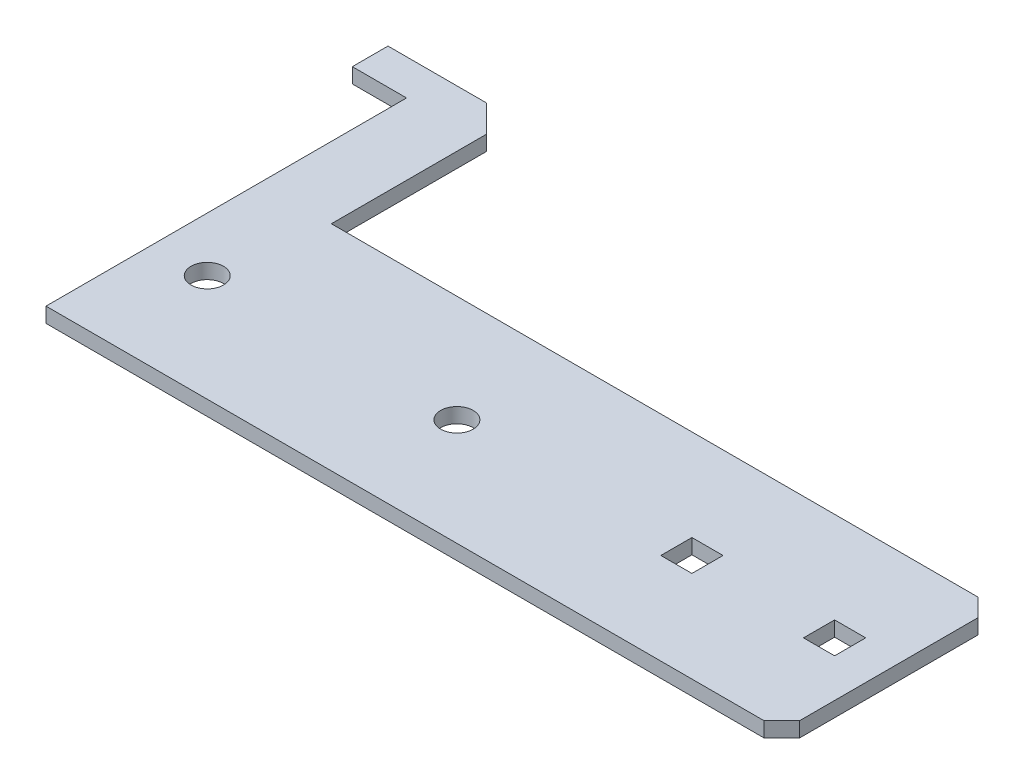
ISO-10303-21;
HEADER;
FILE_DESCRIPTION(('STEP AP214'),'2;1');
FILE_NAME('part.step','',(''),(''),'','','');
FILE_SCHEMA(('AUTOMOTIVE_DESIGN { 1 0 10303 214 1 1 1 1 }'));
ENDSEC;
DATA;
#1=APPLICATION_CONTEXT('core data for automotive mechanical design processes');
#2=APPLICATION_PROTOCOL_DEFINITION('international standard','automotive_design',2000,#1);
#3=PRODUCT_CONTEXT('',#1,'mechanical');
#4=PRODUCT('Part','Part','',(#3));
#5=PRODUCT_RELATED_PRODUCT_CATEGORY('part','',(#4));
#6=PRODUCT_DEFINITION_FORMATION('','',#4);
#7=PRODUCT_DEFINITION_CONTEXT('part definition',#1,'design');
#8=PRODUCT_DEFINITION('design','',#6,#7);
#9=PRODUCT_DEFINITION_SHAPE('','',#8);
#10=(LENGTH_UNIT() NAMED_UNIT(*) SI_UNIT(.MILLI.,.METRE.));
#11=(NAMED_UNIT(*) PLANE_ANGLE_UNIT() SI_UNIT($,.RADIAN.));
#12=(NAMED_UNIT(*) SI_UNIT($,.STERADIAN.) SOLID_ANGLE_UNIT());
#13=UNCERTAINTY_MEASURE_WITH_UNIT(LENGTH_MEASURE(1.E-05),#10,'distance_accuracy_value','');
#14=(GEOMETRIC_REPRESENTATION_CONTEXT(3) GLOBAL_UNCERTAINTY_ASSIGNED_CONTEXT((#13)) GLOBAL_UNIT_ASSIGNED_CONTEXT((#10,
#11,#12)) REPRESENTATION_CONTEXT('',''));
#15=CARTESIAN_POINT('',(0.,0.,0.));
#16=DIRECTION('',(0.,0.,1.));
#17=DIRECTION('',(1.,0.,0.));
#18=AXIS2_PLACEMENT_3D('',#15,#16,#17);
#19=CARTESIAN_POINT('',(66.6427164995796,0.,19.05));
#20=DIRECTION('',(0.,0.,1.));
#21=DIRECTION('',(-1.,0.,0.));
#22=AXIS2_PLACEMENT_3D('',#19,#20,#21);
#23=PLANE('',#22);
#24=DIRECTION('',(-1.,0.,0.));
#25=VECTOR('',#24,1.);
#26=CARTESIAN_POINT('',(66.6427164995796,0.,19.05));
#27=LINE('',#26,#25);
#28=CARTESIAN_POINT('',(127.815201616605,0.,19.05));
#29=VERTEX_POINT('',#28);
#30=CARTESIAN_POINT('',(0.,0.,19.05));
#31=VERTEX_POINT('',#30);
#32=EDGE_CURVE('E13',#29,#31,#27,.T.);
#33=ORIENTED_EDGE('',*,*,#32,.T.);
#34=DIRECTION('',(0.,1.,0.));
#35=VECTOR('',#34,1.);
#36=CARTESIAN_POINT('',(0.,0.,19.05));
#37=LINE('',#36,#35);
#38=CARTESIAN_POINT('',(0.,-2.667,19.05));
#39=VERTEX_POINT('',#38);
#40=EDGE_CURVE('E445',#39,#31,#37,.T.);
#41=ORIENTED_EDGE('',*,*,#40,.F.);
#42=DIRECTION('',(1.,0.,0.));
#43=VECTOR('',#42,1.);
#44=CARTESIAN_POINT('',(66.6427164995796,-2.667,19.05));
#45=LINE('',#44,#43);
#46=CARTESIAN_POINT('',(127.815201616605,-2.667,19.05));
#47=VERTEX_POINT('',#46);
#48=EDGE_CURVE('E183',#47,#39,#45,.F.);
#49=ORIENTED_EDGE('',*,*,#48,.F.);
#50=DIRECTION('',(0.,1.,0.));
#51=VECTOR('',#50,1.);
#52=CARTESIAN_POINT('',(127.815201616605,0.,19.05));
#53=LINE('',#52,#51);
#54=EDGE_CURVE('E301',#47,#29,#53,.T.);
#55=ORIENTED_EDGE('',*,*,#54,.T.);
#56=EDGE_LOOP('',(#33,#41,#49,#55));
#57=FACE_BOUND('',#56,.T.);
#58=ADVANCED_FACE('F77',(#57),#23,.T.);
#59=CARTESIAN_POINT('',(66.6427164995796,0.,-19.05));
#60=DIRECTION('',(0.,0.,1.));
#61=DIRECTION('',(-1.,0.,0.));
#62=AXIS2_PLACEMENT_3D('',#59,#60,#61);
#63=PLANE('',#62);
#64=DIRECTION('',(1.,0.,0.));
#65=VECTOR('',#64,1.);
#66=CARTESIAN_POINT('',(66.6427164995796,-2.667,-19.05));
#67=LINE('',#66,#65);
#68=CARTESIAN_POINT('',(127.815201616605,-2.667,-19.05));
#69=VERTEX_POINT('',#68);
#70=CARTESIAN_POINT('',(12.7,-2.66699999999987,-19.05));
#71=VERTEX_POINT('',#70);
#72=EDGE_CURVE('E81',#69,#71,#67,.F.);
#73=ORIENTED_EDGE('',*,*,#72,.T.);
#74=DIRECTION('',(0.,1.,0.));
#75=VECTOR('',#74,1.);
#76=CARTESIAN_POINT('',(12.7,-2.66699999999987,-19.05));
#77=LINE('',#76,#75);
#78=CARTESIAN_POINT('',(12.7,0.,-19.05));
#79=VERTEX_POINT('',#78);
#80=EDGE_CURVE('E421',#71,#79,#77,.T.);
#81=ORIENTED_EDGE('',*,*,#80,.T.);
#82=DIRECTION('',(-1.,0.,0.));
#83=VECTOR('',#82,1.);
#84=CARTESIAN_POINT('',(66.6427164995796,0.,-19.05));
#85=LINE('',#84,#83);
#86=CARTESIAN_POINT('',(127.815201616605,0.,-19.05));
#87=VERTEX_POINT('',#86);
#88=EDGE_CURVE('E88',#87,#79,#85,.T.);
#89=ORIENTED_EDGE('',*,*,#88,.F.);
#90=DIRECTION('',(0.,1.,0.));
#91=VECTOR('',#90,1.);
#92=CARTESIAN_POINT('',(127.815201616605,0.,-19.05));
#93=LINE('',#92,#91);
#94=EDGE_CURVE('E292',#87,#69,#93,.F.);
#95=ORIENTED_EDGE('',*,*,#94,.T.);
#96=EDGE_LOOP('',(#73,#81,#89,#95));
#97=FACE_BOUND('',#96,.T.);
#98=ADVANCED_FACE('F419',(#97),#63,.F.);
#99=CARTESIAN_POINT('',(0.,0.,19.05));
#100=DIRECTION('',(0.,-1.,0.));
#101=DIRECTION('',(1.,0.,0.));
#102=AXIS2_PLACEMENT_3D('',#99,#100,#101);
#103=PLANE('',#102);
#104=ORIENTED_EDGE('',*,*,#88,.T.);
#105=DIRECTION('',(0.,0.,1.));
#106=VECTOR('',#105,1.);
#107=CARTESIAN_POINT('',(12.7,1.17961196366423E-13,-31.9266755627747));
#108=LINE('',#107,#106);
#109=CARTESIAN_POINT('',(12.6999999999998,2.22044604925031E-13,-46.6586755627749));
#110=VERTEX_POINT('',#109);
#111=EDGE_CURVE('E263',#110,#79,#108,.T.);
#112=ORIENTED_EDGE('',*,*,#111,.F.);
#113=DIRECTION('',(0.707106781186553,0.,0.707106781186542));
#114=VECTOR('',#113,1.);
#115=CARTESIAN_POINT('',(15.0494999999999,2.28983498828939E-13,-44.3091755627748));
#116=LINE('',#115,#114);
#117=CARTESIAN_POINT('',(7.87399999999977,2.0122792321331E-13,-51.4846755627748));
#118=VERTEX_POINT('',#117);
#119=EDGE_CURVE('E250',#110,#118,#116,.F.);
#120=ORIENTED_EDGE('',*,*,#119,.T.);
#121=DIRECTION('',(1.,0.,0.));
#122=VECTOR('',#121,1.);
#123=CARTESIAN_POINT('',(12.6999999999997,2.4980018054066E-13,-51.4846755627749));
#124=LINE('',#123,#122);
#125=CARTESIAN_POINT('',(-9.65200000000025,0.,-51.4846755627746));
#126=VERTEX_POINT('',#125);
#127=EDGE_CURVE('E273',#126,#118,#124,.T.);
#128=ORIENTED_EDGE('',*,*,#127,.F.);
#129=DIRECTION('',(0.,0.,-1.));
#130=VECTOR('',#129,1.);
#131=CARTESIAN_POINT('',(-9.65200000000025,0.,-51.4846755627746));
#132=LINE('',#131,#130);
#133=CARTESIAN_POINT('',(-9.65200000000018,0.,-45.1346755627746));
#134=VERTEX_POINT('',#133);
#135=EDGE_CURVE('E281',#134,#126,#132,.T.);
#136=ORIENTED_EDGE('',*,*,#135,.F.);
#137=DIRECTION('',(-1.,0.,0.));
#138=VECTOR('',#137,1.);
#139=CARTESIAN_POINT('',(-1.84688911891214E-13,0.,-45.1346755627747));
#140=LINE('',#139,#138);
#141=CARTESIAN_POINT('',(-1.84074279221134E-13,0.,-45.1346755627747));
#142=VERTEX_POINT('',#141);
#143=EDGE_CURVE('E287',#142,#134,#140,.T.);
#144=ORIENTED_EDGE('',*,*,#143,.F.);
#145=DIRECTION('',(0.,0.,-1.));
#146=VECTOR('',#145,1.);
#147=CARTESIAN_POINT('',(-2.53759104787382E-13,1.11022302462516E-13,-51.4846755627747));
#148=LINE('',#147,#146);
#149=EDGE_CURVE('E221',#31,#142,#148,.T.);
#150=ORIENTED_EDGE('',*,*,#149,.F.);
#151=ORIENTED_EDGE('',*,*,#32,.F.);
#152=DIRECTION('',(0.707106781186549,0.,-0.707106781186546));
#153=VECTOR('',#152,1.);
#154=CARTESIAN_POINT('',(127.815201616605,0.,19.05));
#155=LINE('',#154,#153);
#156=CARTESIAN_POINT('',(130.990201616605,0.,15.875));
#157=VERTEX_POINT('',#156);
#158=EDGE_CURVE('E311',#29,#157,#155,.T.);
#159=ORIENTED_EDGE('',*,*,#158,.T.);
#160=DIRECTION('',(0.,0.,-1.));
#161=VECTOR('',#160,1.);
#162=CARTESIAN_POINT('',(130.990201616605,0.,19.05));
#163=LINE('',#162,#161);
#164=CARTESIAN_POINT('',(130.990201616605,0.,-15.875));
#165=VERTEX_POINT('',#164);
#166=EDGE_CURVE('E307',#157,#165,#163,.T.);
#167=ORIENTED_EDGE('',*,*,#166,.T.);
#168=DIRECTION('',(0.707106781186549,0.,0.707106781186546));
#169=VECTOR('',#168,1.);
#170=CARTESIAN_POINT('',(130.990201616605,0.,-15.875));
#171=LINE('',#170,#169);
#172=EDGE_CURVE('E176',#165,#87,#171,.F.);
#173=ORIENTED_EDGE('',*,*,#172,.T.);
#174=EDGE_LOOP('',(#104,#112,#120,#128,#136,#144,#150,#151,#159,#167,#173));
#175=FACE_BOUND('',#174,.T.);
#176=DIRECTION('',(1.,0.,0.));
#177=VECTOR('',#176,1.);
#178=CARTESIAN_POINT('',(82.374601616605,0.,-2.7686));
#179=LINE('',#178,#177);
#180=CARTESIAN_POINT('',(93.169601616605,0.,-2.7686));
#181=VERTEX_POINT('',#180);
#182=CARTESIAN_POINT('',(98.706801616605,0.,-2.7686));
#183=VERTEX_POINT('',#182);
#184=EDGE_CURVE('E342',#181,#183,#179,.T.);
#185=ORIENTED_EDGE('',*,*,#184,.T.);
#186=DIRECTION('',(0.,0.,1.));
#187=VECTOR('',#186,1.);
#188=CARTESIAN_POINT('',(98.706801616605,0.,19.05));
#189=LINE('',#188,#187);
#190=CARTESIAN_POINT('',(98.706801616605,0.,2.7686));
#191=VERTEX_POINT('',#190);
#192=EDGE_CURVE('E338',#183,#191,#189,.T.);
#193=ORIENTED_EDGE('',*,*,#192,.T.);
#194=DIRECTION('',(-1.,0.,0.));
#195=VECTOR('',#194,1.);
#196=CARTESIAN_POINT('',(82.374601616605,0.,2.7686));
#197=LINE('',#196,#195);
#198=CARTESIAN_POINT('',(93.169601616605,0.,2.7686));
#199=VERTEX_POINT('',#198);
#200=EDGE_CURVE('E334',#191,#199,#197,.T.);
#201=ORIENTED_EDGE('',*,*,#200,.T.);
#202=DIRECTION('',(0.,0.,-1.));
#203=VECTOR('',#202,1.);
#204=CARTESIAN_POINT('',(93.169601616605,0.,19.05));
#205=LINE('',#204,#203);
#206=EDGE_CURVE('E330',#199,#181,#205,.T.);
#207=ORIENTED_EDGE('',*,*,#206,.T.);
#208=EDGE_LOOP('',(#185,#193,#201,#207));
#209=FACE_BOUND('',#208,.T.);
#210=DIRECTION('',(1.,0.,0.));
#211=VECTOR('',#210,1.);
#212=CARTESIAN_POINT('',(82.374601616605,0.,-2.7686));
#213=LINE('',#212,#211);
#214=CARTESIAN_POINT('',(118.569601616605,0.,-2.7686));
#215=VERTEX_POINT('',#214);
#216=CARTESIAN_POINT('',(124.106801616605,0.,-2.7686));
#217=VERTEX_POINT('',#216);
#218=EDGE_CURVE('E326',#215,#217,#213,.T.);
#219=ORIENTED_EDGE('',*,*,#218,.T.);
#220=DIRECTION('',(0.,0.,1.));
#221=VECTOR('',#220,1.);
#222=CARTESIAN_POINT('',(124.106801616605,0.,19.05));
#223=LINE('',#222,#221);
#224=CARTESIAN_POINT('',(124.106801616605,0.,2.7686));
#225=VERTEX_POINT('',#224);
#226=EDGE_CURVE('E322',#217,#225,#223,.T.);
#227=ORIENTED_EDGE('',*,*,#226,.T.);
#228=DIRECTION('',(-1.,0.,0.));
#229=VECTOR('',#228,1.);
#230=CARTESIAN_POINT('',(82.374601616605,0.,2.7686));
#231=LINE('',#230,#229);
#232=CARTESIAN_POINT('',(118.569601616605,0.,2.7686));
#233=VERTEX_POINT('',#232);
#234=EDGE_CURVE('E318',#225,#233,#231,.T.);
#235=ORIENTED_EDGE('',*,*,#234,.T.);
#236=DIRECTION('',(0.,0.,-1.));
#237=VECTOR('',#236,1.);
#238=CARTESIAN_POINT('',(118.569601616605,0.,19.05));
#239=LINE('',#238,#237);
#240=EDGE_CURVE('E314',#233,#215,#239,.T.);
#241=ORIENTED_EDGE('',*,*,#240,.T.);
#242=EDGE_LOOP('',(#219,#227,#235,#241));
#243=FACE_BOUND('',#242,.T.);
#244=CARTESIAN_POINT('',(9.652,0.,0.));
#245=DIRECTION('',(0.,1.,0.));
#246=DIRECTION('',(-1.,0.,0.));
#247=AXIS2_PLACEMENT_3D('',#244,#245,#246);
#248=CIRCLE('',#247,2.8956);
#249=CARTESIAN_POINT('',(12.5476,0.,0.));
#250=VERTEX_POINT('',#249);
#251=EDGE_CURVE('E430',#250,#250,#248,.T.);
#252=ORIENTED_EDGE('',*,*,#251,.F.);
#253=EDGE_LOOP('',(#252));
#254=FACE_BOUND('',#253,.T.);
#255=CARTESIAN_POINT('',(54.102,0.,0.));
#256=DIRECTION('',(0.,1.,0.));
#257=DIRECTION('',(-1.,0.,0.));
#258=AXIS2_PLACEMENT_3D('',#255,#256,#257);
#259=CIRCLE('',#258,2.8956);
#260=CARTESIAN_POINT('',(56.9976,0.,0.));
#261=VERTEX_POINT('',#260);
#262=EDGE_CURVE('E438',#261,#261,#259,.T.);
#263=ORIENTED_EDGE('',*,*,#262,.F.);
#264=EDGE_LOOP('',(#263));
#265=FACE_BOUND('',#264,.T.);
#266=ADVANCED_FACE('F79',(#175,#209,#243,#254,#265),#103,.F.);
#267=CARTESIAN_POINT('',(66.6427164995796,-2.667,19.05));
#268=DIRECTION('',(0.,-1.,0.));
#269=DIRECTION('',(1.,0.,0.));
#270=AXIS2_PLACEMENT_3D('',#267,#268,#269);
#271=PLANE('',#270);
#272=ORIENTED_EDGE('',*,*,#72,.F.);
#273=DIRECTION('',(-0.707106781186549,0.,-0.707106781186546));
#274=VECTOR('',#273,1.);
#275=CARTESIAN_POINT('',(124.144901616605,-2.66700000000002,-22.7203000000001));
#276=LINE('',#275,#274);
#277=CARTESIAN_POINT('',(130.990201616605,-2.66700000000001,-15.875));
#278=VERTEX_POINT('',#277);
#279=EDGE_CURVE('E295',#69,#278,#276,.F.);
#280=ORIENTED_EDGE('',*,*,#279,.T.);
#281=DIRECTION('',(0.,0.,-1.));
#282=VECTOR('',#281,1.);
#283=CARTESIAN_POINT('',(130.990201616605,-2.66700000000001,19.05));
#284=LINE('',#283,#282);
#285=CARTESIAN_POINT('',(130.990201616605,-2.66700000000001,15.875));
#286=VERTEX_POINT('',#285);
#287=EDGE_CURVE('E405',#286,#278,#284,.T.);
#288=ORIENTED_EDGE('',*,*,#287,.F.);
#289=DIRECTION('',(-0.707106781186549,0.,0.707106781186546));
#290=VECTOR('',#289,1.);
#291=CARTESIAN_POINT('',(105.094901616605,-2.667,41.7703));
#292=LINE('',#291,#290);
#293=EDGE_CURVE('E298',#286,#47,#292,.T.);
#294=ORIENTED_EDGE('',*,*,#293,.T.);
#295=ORIENTED_EDGE('',*,*,#48,.T.);
#296=DIRECTION('',(0.,0.,1.));
#297=VECTOR('',#296,1.);
#298=CARTESIAN_POINT('',(0.,-2.66700000000004,-29.2596755627747));
#299=LINE('',#298,#297);
#300=CARTESIAN_POINT('',(-1.54682543963391E-13,-2.66699999999993,-45.1346755627747));
#301=VERTEX_POINT('',#300);
#302=EDGE_CURVE('E226',#39,#301,#299,.F.);
#303=ORIENTED_EDGE('',*,*,#302,.T.);
#304=DIRECTION('',(-1.,0.,0.));
#305=VECTOR('',#304,1.);
#306=CARTESIAN_POINT('',(-1.5529717663347E-13,-2.66699999999999,-45.1346755627747));
#307=LINE('',#306,#305);
#308=CARTESIAN_POINT('',(-9.65200000000016,-2.66700000000009,-45.1346755627746));
#309=VERTEX_POINT('',#308);
#310=EDGE_CURVE('E237',#301,#309,#307,.T.);
#311=ORIENTED_EDGE('',*,*,#310,.T.);
#312=DIRECTION('',(0.,0.,-1.));
#313=VECTOR('',#312,1.);
#314=CARTESIAN_POINT('',(-9.65200000000022,-2.66700000000007,-51.4846755627746));
#315=LINE('',#314,#313);
#316=CARTESIAN_POINT('',(-9.65200000000022,-2.66700000000007,-51.4846755627746));
#317=VERTEX_POINT('',#316);
#318=EDGE_CURVE('E246',#309,#317,#315,.T.);
#319=ORIENTED_EDGE('',*,*,#318,.T.);
#320=DIRECTION('',(-1.,0.,0.));
#321=VECTOR('',#320,1.);
#322=CARTESIAN_POINT('',(-2.25277498675718E-13,-2.66699999999988,-51.4846755627748));
#323=LINE('',#322,#321);
#324=CARTESIAN_POINT('',(7.87399999999981,-2.6669999999998,-51.4846755627748));
#325=VERTEX_POINT('',#324);
#326=EDGE_CURVE('E259',#317,#325,#323,.F.);
#327=ORIENTED_EDGE('',*,*,#326,.T.);
#328=DIRECTION('',(-0.707106781186553,0.,-0.707106781186542));
#329=VECTOR('',#328,1.);
#330=CARTESIAN_POINT('',(7.87399999999981,-2.6669999999998,-51.4846755627748));
#331=LINE('',#330,#329);
#332=CARTESIAN_POINT('',(12.6999999999998,-2.66699999999978,-46.6586755627749));
#333=VERTEX_POINT('',#332);
#334=EDGE_CURVE('E256',#325,#333,#331,.F.);
#335=ORIENTED_EDGE('',*,*,#334,.T.);
#336=DIRECTION('',(0.,0.,-1.));
#337=VECTOR('',#336,1.);
#338=CARTESIAN_POINT('',(12.7,-2.6669999999999,-29.2596755627748));
#339=LINE('',#338,#337);
#340=EDGE_CURVE('E239',#333,#71,#339,.F.);
#341=ORIENTED_EDGE('',*,*,#340,.T.);
#342=EDGE_LOOP('',(#272,#280,#288,#294,#295,#303,#311,#319,#327,#335,#341));
#343=FACE_BOUND('',#342,.T.);
#344=DIRECTION('',(1.,0.,0.));
#345=VECTOR('',#344,1.);
#346=CARTESIAN_POINT('',(82.374601616605,-2.66700000000001,-2.7686));
#347=LINE('',#346,#345);
#348=CARTESIAN_POINT('',(93.169601616605,-2.66700000000001,-2.7686));
#349=VERTEX_POINT('',#348);
#350=CARTESIAN_POINT('',(98.706801616605,-2.66700000000001,-2.7686));
#351=VERTEX_POINT('',#350);
#352=EDGE_CURVE('E349',#349,#351,#347,.T.);
#353=ORIENTED_EDGE('',*,*,#352,.F.);
#354=DIRECTION('',(0.,0.,-1.));
#355=VECTOR('',#354,1.);
#356=CARTESIAN_POINT('',(93.169601616605,-2.66700000000001,19.05));
#357=LINE('',#356,#355);
#358=CARTESIAN_POINT('',(93.169601616605,-2.66700000000001,2.7686));
#359=VERTEX_POINT('',#358);
#360=EDGE_CURVE('E370',#359,#349,#357,.T.);
#361=ORIENTED_EDGE('',*,*,#360,.F.);
#362=DIRECTION('',(1.,0.,0.));
#363=VECTOR('',#362,1.);
#364=CARTESIAN_POINT('',(82.374601616605,-2.66700000000001,2.7686));
#365=LINE('',#364,#363);
#366=CARTESIAN_POINT('',(98.706801616605,-2.66700000000001,2.7686));
#367=VERTEX_POINT('',#366);
#368=EDGE_CURVE('E363',#367,#359,#365,.F.);
#369=ORIENTED_EDGE('',*,*,#368,.F.);
#370=DIRECTION('',(0.,0.,-1.));
#371=VECTOR('',#370,1.);
#372=CARTESIAN_POINT('',(98.706801616605,-2.66700000000001,19.05));
#373=LINE('',#372,#371);
#374=EDGE_CURVE('E356',#351,#367,#373,.F.);
#375=ORIENTED_EDGE('',*,*,#374,.F.);
#376=EDGE_LOOP('',(#353,#361,#369,#375));
#377=FACE_BOUND('',#376,.T.);
#378=DIRECTION('',(1.,0.,0.));
#379=VECTOR('',#378,1.);
#380=CARTESIAN_POINT('',(82.374601616605,-2.66700000000001,-2.7686));
#381=LINE('',#380,#379);
#382=CARTESIAN_POINT('',(118.569601616605,-2.66700000000001,-2.7686));
#383=VERTEX_POINT('',#382);
#384=CARTESIAN_POINT('',(124.106801616605,-2.66700000000002,-2.7686));
#385=VERTEX_POINT('',#384);
#386=EDGE_CURVE('E377',#383,#385,#381,.T.);
#387=ORIENTED_EDGE('',*,*,#386,.F.);
#388=DIRECTION('',(0.,0.,-1.));
#389=VECTOR('',#388,1.);
#390=CARTESIAN_POINT('',(118.569601616605,-2.66700000000001,19.05));
#391=LINE('',#390,#389);
#392=CARTESIAN_POINT('',(118.569601616605,-2.66700000000001,2.7686));
#393=VERTEX_POINT('',#392);
#394=EDGE_CURVE('E398',#393,#383,#391,.T.);
#395=ORIENTED_EDGE('',*,*,#394,.F.);
#396=DIRECTION('',(1.,0.,0.));
#397=VECTOR('',#396,1.);
#398=CARTESIAN_POINT('',(82.374601616605,-2.66700000000001,2.7686));
#399=LINE('',#398,#397);
#400=CARTESIAN_POINT('',(124.106801616605,-2.66700000000002,2.7686));
#401=VERTEX_POINT('',#400);
#402=EDGE_CURVE('E391',#401,#393,#399,.F.);
#403=ORIENTED_EDGE('',*,*,#402,.F.);
#404=DIRECTION('',(0.,0.,-1.));
#405=VECTOR('',#404,1.);
#406=CARTESIAN_POINT('',(124.106801616605,-2.66700000000002,19.05));
#407=LINE('',#406,#405);
#408=EDGE_CURVE('E384',#385,#401,#407,.F.);
#409=ORIENTED_EDGE('',*,*,#408,.F.);
#410=EDGE_LOOP('',(#387,#395,#403,#409));
#411=FACE_BOUND('',#410,.T.);
#412=CARTESIAN_POINT('',(9.652,-2.667,0.));
#413=DIRECTION('',(0.,1.,0.));
#414=DIRECTION('',(-1.,0.,0.));
#415=AXIS2_PLACEMENT_3D('',#412,#413,#414);
#416=CIRCLE('',#415,2.8956);
#417=CARTESIAN_POINT('',(12.5476,-2.667,0.));
#418=VERTEX_POINT('',#417);
#419=EDGE_CURVE('E429',#418,#418,#416,.T.);
#420=ORIENTED_EDGE('',*,*,#419,.T.);
#421=EDGE_LOOP('',(#420));
#422=FACE_BOUND('',#421,.T.);
#423=CARTESIAN_POINT('',(54.102,-2.667,0.));
#424=DIRECTION('',(0.,1.,0.));
#425=DIRECTION('',(-1.,0.,0.));
#426=AXIS2_PLACEMENT_3D('',#423,#424,#425);
#427=CIRCLE('',#426,2.8956);
#428=CARTESIAN_POINT('',(56.9976,-2.667,0.));
#429=VERTEX_POINT('',#428);
#430=EDGE_CURVE('E410',#429,#429,#427,.T.);
#431=ORIENTED_EDGE('',*,*,#430,.T.);
#432=EDGE_LOOP('',(#431));
#433=FACE_BOUND('',#432,.T.);
#434=ADVANCED_FACE('F234',(#343,#377,#411,#422,#433),#271,.T.);
#435=CARTESIAN_POINT('',(130.990201616605,0.,-15.875));
#436=DIRECTION('',(-0.707106781186546,0.,0.707106781186549));
#437=DIRECTION('',(0.,1.,0.));
#438=AXIS2_PLACEMENT_3D('',#435,#436,#437);
#439=PLANE('',#438);
#440=ORIENTED_EDGE('',*,*,#279,.F.);
#441=ORIENTED_EDGE('',*,*,#94,.F.);
#442=ORIENTED_EDGE('',*,*,#172,.F.);
#443=DIRECTION('',(0.,-1.,0.));
#444=VECTOR('',#443,1.);
#445=CARTESIAN_POINT('',(130.990201616605,0.,-15.875));
#446=LINE('',#445,#444);
#447=EDGE_CURVE('E402',#278,#165,#446,.F.);
#448=ORIENTED_EDGE('',*,*,#447,.F.);
#449=EDGE_LOOP('',(#440,#441,#442,#448));
#450=FACE_BOUND('',#449,.T.);
#451=ADVANCED_FACE('F478',(#450),#439,.F.);
#452=CARTESIAN_POINT('',(130.990201616605,0.,19.05));
#453=DIRECTION('',(-1.,0.,0.));
#454=DIRECTION('',(0.,0.,-1.));
#455=AXIS2_PLACEMENT_3D('',#452,#453,#454);
#456=PLANE('',#455);
#457=ORIENTED_EDGE('',*,*,#166,.F.);
#458=DIRECTION('',(0.,1.,0.));
#459=VECTOR('',#458,1.);
#460=CARTESIAN_POINT('',(130.990201616605,0.,15.875));
#461=LINE('',#460,#459);
#462=EDGE_CURVE('E168',#157,#286,#461,.F.);
#463=ORIENTED_EDGE('',*,*,#462,.T.);
#464=ORIENTED_EDGE('',*,*,#287,.T.);
#465=ORIENTED_EDGE('',*,*,#447,.T.);
#466=EDGE_LOOP('',(#457,#463,#464,#465));
#467=FACE_BOUND('',#466,.T.);
#468=ADVANCED_FACE('F518',(#467),#456,.F.);
#469=CARTESIAN_POINT('',(127.815201616605,0.,19.05));
#470=DIRECTION('',(0.707106781186546,0.,0.707106781186549));
#471=DIRECTION('',(0.,-1.,0.));
#472=AXIS2_PLACEMENT_3D('',#469,#470,#471);
#473=PLANE('',#472);
#474=ORIENTED_EDGE('',*,*,#293,.F.);
#475=ORIENTED_EDGE('',*,*,#462,.F.);
#476=ORIENTED_EDGE('',*,*,#158,.F.);
#477=ORIENTED_EDGE('',*,*,#54,.F.);
#478=EDGE_LOOP('',(#474,#475,#476,#477));
#479=FACE_BOUND('',#478,.T.);
#480=ADVANCED_FACE('F510',(#479),#473,.T.);
#481=CARTESIAN_POINT('',(118.569601616605,0.,19.05));
#482=DIRECTION('',(-1.,0.,0.));
#483=DIRECTION('',(0.,0.,-1.));
#484=AXIS2_PLACEMENT_3D('',#481,#482,#483);
#485=PLANE('',#484);
#486=DIRECTION('',(0.,1.,0.));
#487=VECTOR('',#486,1.);
#488=CARTESIAN_POINT('',(118.569601616605,0.,2.7686));
#489=LINE('',#488,#487);
#490=EDGE_CURVE('E388',#393,#233,#489,.T.);
#491=ORIENTED_EDGE('',*,*,#490,.F.);
#492=ORIENTED_EDGE('',*,*,#394,.T.);
#493=DIRECTION('',(0.,1.,0.));
#494=VECTOR('',#493,1.);
#495=CARTESIAN_POINT('',(118.569601616605,0.,-2.7686));
#496=LINE('',#495,#494);
#497=EDGE_CURVE('E395',#383,#215,#496,.T.);
#498=ORIENTED_EDGE('',*,*,#497,.T.);
#499=ORIENTED_EDGE('',*,*,#240,.F.);
#500=EDGE_LOOP('',(#491,#492,#498,#499));
#501=FACE_BOUND('',#500,.T.);
#502=ADVANCED_FACE('F506',(#501),#485,.F.);
#503=CARTESIAN_POINT('',(82.374601616605,0.,2.7686));
#504=DIRECTION('',(0.,0.,1.));
#505=DIRECTION('',(-1.,0.,0.));
#506=AXIS2_PLACEMENT_3D('',#503,#504,#505);
#507=PLANE('',#506);
#508=DIRECTION('',(0.,1.,0.));
#509=VECTOR('',#508,1.);
#510=CARTESIAN_POINT('',(124.106801616605,0.,2.7686));
#511=LINE('',#510,#509);
#512=EDGE_CURVE('E381',#401,#225,#511,.T.);
#513=ORIENTED_EDGE('',*,*,#512,.F.);
#514=ORIENTED_EDGE('',*,*,#402,.T.);
#515=ORIENTED_EDGE('',*,*,#490,.T.);
#516=ORIENTED_EDGE('',*,*,#234,.F.);
#517=EDGE_LOOP('',(#513,#514,#515,#516));
#518=FACE_BOUND('',#517,.T.);
#519=ADVANCED_FACE('F502',(#518),#507,.F.);
#520=CARTESIAN_POINT('',(124.106801616605,0.,19.05));
#521=DIRECTION('',(1.,0.,0.));
#522=DIRECTION('',(0.,0.,1.));
#523=AXIS2_PLACEMENT_3D('',#520,#521,#522);
#524=PLANE('',#523);
#525=ORIENTED_EDGE('',*,*,#408,.T.);
#526=ORIENTED_EDGE('',*,*,#512,.T.);
#527=ORIENTED_EDGE('',*,*,#226,.F.);
#528=DIRECTION('',(0.,1.,0.));
#529=VECTOR('',#528,1.);
#530=CARTESIAN_POINT('',(124.106801616605,0.,-2.7686));
#531=LINE('',#530,#529);
#532=EDGE_CURVE('E374',#385,#217,#531,.T.);
#533=ORIENTED_EDGE('',*,*,#532,.F.);
#534=EDGE_LOOP('',(#525,#526,#527,#533));
#535=FACE_BOUND('',#534,.T.);
#536=ADVANCED_FACE('F498',(#535),#524,.F.);
#537=CARTESIAN_POINT('',(82.374601616605,0.,-2.7686));
#538=DIRECTION('',(0.,0.,-1.));
#539=DIRECTION('',(1.,0.,0.));
#540=AXIS2_PLACEMENT_3D('',#537,#538,#539);
#541=PLANE('',#540);
#542=ORIENTED_EDGE('',*,*,#497,.F.);
#543=ORIENTED_EDGE('',*,*,#386,.T.);
#544=ORIENTED_EDGE('',*,*,#532,.T.);
#545=ORIENTED_EDGE('',*,*,#218,.F.);
#546=EDGE_LOOP('',(#542,#543,#544,#545));
#547=FACE_BOUND('',#546,.T.);
#548=ADVANCED_FACE('F494',(#547),#541,.F.);
#549=CARTESIAN_POINT('',(93.169601616605,0.,19.05));
#550=DIRECTION('',(-1.,0.,0.));
#551=DIRECTION('',(0.,0.,-1.));
#552=AXIS2_PLACEMENT_3D('',#549,#550,#551);
#553=PLANE('',#552);
#554=DIRECTION('',(0.,1.,0.));
#555=VECTOR('',#554,1.);
#556=CARTESIAN_POINT('',(93.169601616605,0.,2.7686));
#557=LINE('',#556,#555);
#558=EDGE_CURVE('E360',#359,#199,#557,.T.);
#559=ORIENTED_EDGE('',*,*,#558,.F.);
#560=ORIENTED_EDGE('',*,*,#360,.T.);
#561=DIRECTION('',(0.,1.,0.));
#562=VECTOR('',#561,1.);
#563=CARTESIAN_POINT('',(93.169601616605,0.,-2.7686));
#564=LINE('',#563,#562);
#565=EDGE_CURVE('E367',#349,#181,#564,.T.);
#566=ORIENTED_EDGE('',*,*,#565,.T.);
#567=ORIENTED_EDGE('',*,*,#206,.F.);
#568=EDGE_LOOP('',(#559,#560,#566,#567));
#569=FACE_BOUND('',#568,.T.);
#570=ADVANCED_FACE('F490',(#569),#553,.F.);
#571=CARTESIAN_POINT('',(82.374601616605,0.,2.7686));
#572=DIRECTION('',(0.,0.,1.));
#573=DIRECTION('',(-1.,0.,0.));
#574=AXIS2_PLACEMENT_3D('',#571,#572,#573);
#575=PLANE('',#574);
#576=DIRECTION('',(0.,1.,0.));
#577=VECTOR('',#576,1.);
#578=CARTESIAN_POINT('',(98.706801616605,0.,2.7686));
#579=LINE('',#578,#577);
#580=EDGE_CURVE('E353',#367,#191,#579,.T.);
#581=ORIENTED_EDGE('',*,*,#580,.F.);
#582=ORIENTED_EDGE('',*,*,#368,.T.);
#583=ORIENTED_EDGE('',*,*,#558,.T.);
#584=ORIENTED_EDGE('',*,*,#200,.F.);
#585=EDGE_LOOP('',(#581,#582,#583,#584));
#586=FACE_BOUND('',#585,.T.);
#587=ADVANCED_FACE('F486',(#586),#575,.F.);
#588=CARTESIAN_POINT('',(98.706801616605,0.,19.05));
#589=DIRECTION('',(1.,0.,0.));
#590=DIRECTION('',(0.,0.,1.));
#591=AXIS2_PLACEMENT_3D('',#588,#589,#590);
#592=PLANE('',#591);
#593=ORIENTED_EDGE('',*,*,#374,.T.);
#594=ORIENTED_EDGE('',*,*,#580,.T.);
#595=ORIENTED_EDGE('',*,*,#192,.F.);
#596=DIRECTION('',(0.,1.,0.));
#597=VECTOR('',#596,1.);
#598=CARTESIAN_POINT('',(98.706801616605,0.,-2.7686));
#599=LINE('',#598,#597);
#600=EDGE_CURVE('E346',#351,#183,#599,.T.);
#601=ORIENTED_EDGE('',*,*,#600,.F.);
#602=EDGE_LOOP('',(#593,#594,#595,#601));
#603=FACE_BOUND('',#602,.T.);
#604=ADVANCED_FACE('F482',(#603),#592,.F.);
#605=CARTESIAN_POINT('',(82.374601616605,0.,-2.7686));
#606=DIRECTION('',(0.,0.,-1.));
#607=DIRECTION('',(1.,0.,0.));
#608=AXIS2_PLACEMENT_3D('',#605,#606,#607);
#609=PLANE('',#608);
#610=ORIENTED_EDGE('',*,*,#565,.F.);
#611=ORIENTED_EDGE('',*,*,#352,.T.);
#612=ORIENTED_EDGE('',*,*,#600,.T.);
#613=ORIENTED_EDGE('',*,*,#184,.F.);
#614=EDGE_LOOP('',(#610,#611,#612,#613));
#615=FACE_BOUND('',#614,.T.);
#616=ADVANCED_FACE('F479',(#615),#609,.F.);
#617=CARTESIAN_POINT('',(-2.53759104787382E-13,1.17961196366423E-13,-51.4846755627747));
#618=DIRECTION('',(-1.,0.,0.));
#619=DIRECTION('',(0.,0.,-1.));
#620=AXIS2_PLACEMENT_3D('',#617,#618,#619);
#621=PLANE('',#620);
#622=DIRECTION('',(0.,-1.,0.));
#623=VECTOR('',#622,1.);
#624=CARTESIAN_POINT('',(-3.12014641475894E-13,11.5535104621929,-45.1346755627746));
#625=LINE('',#624,#623);
#626=EDGE_CURVE('E224',#142,#301,#625,.T.);
#627=ORIENTED_EDGE('',*,*,#626,.T.);
#628=ORIENTED_EDGE('',*,*,#302,.F.);
#629=ORIENTED_EDGE('',*,*,#40,.T.);
#630=ORIENTED_EDGE('',*,*,#149,.T.);
#631=EDGE_LOOP('',(#627,#628,#629,#630));
#632=FACE_BOUND('',#631,.T.);
#633=ADVANCED_FACE('F225',(#632),#621,.T.);
#634=CARTESIAN_POINT('',(-3.12014641475894E-13,11.5535104621929,-45.1346755627746));
#635=DIRECTION('',(0.,0.,1.));
#636=DIRECTION('',(0.,-1.,0.));
#637=AXIS2_PLACEMENT_3D('',#634,#635,#636);
#638=PLANE('',#637);
#639=ORIENTED_EDGE('',*,*,#626,.F.);
#640=ORIENTED_EDGE('',*,*,#143,.T.);
#641=DIRECTION('',(0.,-1.,0.));
#642=VECTOR('',#641,1.);
#643=CARTESIAN_POINT('',(-9.65200000000031,11.5535104621928,-45.1346755627745));
#644=LINE('',#643,#642);
#645=EDGE_CURVE('E243',#134,#309,#644,.T.);
#646=ORIENTED_EDGE('',*,*,#645,.T.);
#647=ORIENTED_EDGE('',*,*,#310,.F.);
#648=EDGE_LOOP('',(#639,#640,#646,#647));
#649=FACE_BOUND('',#648,.T.);
#650=ADVANCED_FACE('F241',(#649),#638,.T.);
#651=CARTESIAN_POINT('',(-9.65200000000038,11.5535104621929,-51.4846755627745));
#652=DIRECTION('',(-1.,0.,0.));
#653=DIRECTION('',(0.,-1.,0.));
#654=AXIS2_PLACEMENT_3D('',#651,#652,#653);
#655=PLANE('',#654);
#656=ORIENTED_EDGE('',*,*,#645,.F.);
#657=ORIENTED_EDGE('',*,*,#135,.T.);
#658=DIRECTION('',(0.,-1.,0.));
#659=VECTOR('',#658,1.);
#660=CARTESIAN_POINT('',(-9.65200000000038,11.5535104621929,-51.4846755627745));
#661=LINE('',#660,#659);
#662=EDGE_CURVE('E277',#126,#317,#661,.T.);
#663=ORIENTED_EDGE('',*,*,#662,.T.);
#664=ORIENTED_EDGE('',*,*,#318,.F.);
#665=EDGE_LOOP('',(#656,#657,#663,#664));
#666=FACE_BOUND('',#665,.T.);
#667=ADVANCED_FACE('F466',(#666),#655,.T.);
#668=CARTESIAN_POINT('',(12.6999999999997,2.56739074444567E-13,-51.4846755627749));
#669=DIRECTION('',(0.,0.,-1.));
#670=DIRECTION('',(0.,1.,0.));
#671=AXIS2_PLACEMENT_3D('',#668,#669,#670);
#672=PLANE('',#671);
#673=ORIENTED_EDGE('',*,*,#127,.T.);
#674=DIRECTION('',(0.,-1.,0.));
#675=VECTOR('',#674,1.);
#676=CARTESIAN_POINT('',(7.87399999999977,2.08166817117217E-13,-51.4846755627748));
#677=LINE('',#676,#675);
#678=EDGE_CURVE('E269',#118,#325,#677,.T.);
#679=ORIENTED_EDGE('',*,*,#678,.T.);
#680=ORIENTED_EDGE('',*,*,#326,.F.);
#681=ORIENTED_EDGE('',*,*,#662,.F.);
#682=EDGE_LOOP('',(#673,#679,#680,#681));
#683=FACE_BOUND('',#682,.T.);
#684=ADVANCED_FACE('F456',(#683),#672,.T.);
#685=CARTESIAN_POINT('',(7.87399999999977,2.08166817117217E-13,-51.4846755627748));
#686=DIRECTION('',(-0.707106781186542,0.,0.707106781186553));
#687=DIRECTION('',(0.,-1.,0.));
#688=AXIS2_PLACEMENT_3D('',#685,#686,#687);
#689=PLANE('',#688);
#690=ORIENTED_EDGE('',*,*,#119,.F.);
#691=DIRECTION('',(0.,1.,0.));
#692=VECTOR('',#691,1.);
#693=CARTESIAN_POINT('',(12.6999999999998,2.22044604925031E-13,-46.6586755627749));
#694=LINE('',#693,#692);
#695=EDGE_CURVE('E266',#333,#110,#694,.T.);
#696=ORIENTED_EDGE('',*,*,#695,.F.);
#697=ORIENTED_EDGE('',*,*,#334,.F.);
#698=ORIENTED_EDGE('',*,*,#678,.F.);
#699=EDGE_LOOP('',(#690,#696,#697,#698));
#700=FACE_BOUND('',#699,.T.);
#701=ADVANCED_FACE('F457',(#700),#689,.F.);
#702=CARTESIAN_POINT('',(12.7,1.2490009027033E-13,-31.9266755627747));
#703=DIRECTION('',(1.,0.,0.));
#704=DIRECTION('',(0.,0.,1.));
#705=AXIS2_PLACEMENT_3D('',#702,#703,#704);
#706=PLANE('',#705);
#707=ORIENTED_EDGE('',*,*,#340,.F.);
#708=ORIENTED_EDGE('',*,*,#695,.T.);
#709=ORIENTED_EDGE('',*,*,#111,.T.);
#710=ORIENTED_EDGE('',*,*,#80,.F.);
#711=EDGE_LOOP('',(#707,#708,#709,#710));
#712=FACE_BOUND('',#711,.T.);
#713=ADVANCED_FACE('F426',(#712),#706,.T.);
#714=CARTESIAN_POINT('',(54.102,0.,0.));
#715=DIRECTION('',(0.,-1.,0.));
#716=DIRECTION('',(1.,0.,0.));
#717=AXIS2_PLACEMENT_3D('',#714,#715,#716);
#718=CYLINDRICAL_SURFACE('',#717,2.8956);
#719=CARTESIAN_POINT('',(56.9976,0.,0.));
#720=CARTESIAN_POINT('',(56.9976,-0.02778125,0.));
#721=CARTESIAN_POINT('',(56.9976,-0.0555625,0.));
#722=CARTESIAN_POINT('',(56.9976,-0.111125,0.));
#723=CARTESIAN_POINT('',(56.9976,-0.13890625,0.));
#724=CARTESIAN_POINT('',(56.9976,-0.19446875,0.));
#725=CARTESIAN_POINT('',(56.9976,-0.22225,0.));
#726=CARTESIAN_POINT('',(56.9976,-0.2778125,0.));
#727=CARTESIAN_POINT('',(56.9976,-0.30559375,0.));
#728=CARTESIAN_POINT('',(56.9976,-0.36115625,0.));
#729=CARTESIAN_POINT('',(56.9976,-0.3889375,0.));
#730=CARTESIAN_POINT('',(56.9976,-0.4445,0.));
#731=CARTESIAN_POINT('',(56.9976,-0.47228125,0.));
#732=CARTESIAN_POINT('',(56.9976,-0.52784375,0.));
#733=CARTESIAN_POINT('',(56.9976,-0.555625,0.));
#734=CARTESIAN_POINT('',(56.9976,-0.6111875,0.));
#735=CARTESIAN_POINT('',(56.9976,-0.63896875,0.));
#736=CARTESIAN_POINT('',(56.9976,-0.69453125,0.));
#737=CARTESIAN_POINT('',(56.9976,-0.7223125,0.));
#738=CARTESIAN_POINT('',(56.9976,-0.777875,0.));
#739=CARTESIAN_POINT('',(56.9976,-0.80565625,0.));
#740=CARTESIAN_POINT('',(56.9976,-0.86121875,0.));
#741=CARTESIAN_POINT('',(56.9976,-0.889,0.));
#742=CARTESIAN_POINT('',(56.9976,-0.9445625,0.));
#743=CARTESIAN_POINT('',(56.9976,-0.97234375,0.));
#744=CARTESIAN_POINT('',(56.9976,-1.02790625,0.));
#745=CARTESIAN_POINT('',(56.9976,-1.0556875,0.));
#746=CARTESIAN_POINT('',(56.9976,-1.11125,0.));
#747=CARTESIAN_POINT('',(56.9976,-1.13903125,0.));
#748=CARTESIAN_POINT('',(56.9976,-1.19459375,0.));
#749=CARTESIAN_POINT('',(56.9976,-1.222375,0.));
#750=CARTESIAN_POINT('',(56.9976,-1.2779375,0.));
#751=CARTESIAN_POINT('',(56.9976,-1.30571875,0.));
#752=CARTESIAN_POINT('',(56.9976,-1.36128125,0.));
#753=CARTESIAN_POINT('',(56.9976,-1.3890625,0.));
#754=CARTESIAN_POINT('',(56.9976,-1.444625,0.));
#755=CARTESIAN_POINT('',(56.9976,-1.47240625,0.));
#756=CARTESIAN_POINT('',(56.9976,-1.52796875,0.));
#757=CARTESIAN_POINT('',(56.9976,-1.55575,0.));
#758=CARTESIAN_POINT('',(56.9976,-1.6113125,0.));
#759=CARTESIAN_POINT('',(56.9976,-1.63909375,0.));
#760=CARTESIAN_POINT('',(56.9976,-1.69465625,0.));
#761=CARTESIAN_POINT('',(56.9976,-1.7224375,0.));
#762=CARTESIAN_POINT('',(56.9976,-1.778,0.));
#763=CARTESIAN_POINT('',(56.9976,-1.80578125,0.));
#764=CARTESIAN_POINT('',(56.9976,-1.86134375,0.));
#765=CARTESIAN_POINT('',(56.9976,-1.889125,0.));
#766=CARTESIAN_POINT('',(56.9976,-1.9446875,0.));
#767=CARTESIAN_POINT('',(56.9976,-1.97246875,0.));
#768=CARTESIAN_POINT('',(56.9976,-2.02803125,0.));
#769=CARTESIAN_POINT('',(56.9976,-2.0558125,0.));
#770=CARTESIAN_POINT('',(56.9976,-2.111375,0.));
#771=CARTESIAN_POINT('',(56.9976,-2.13915625,0.));
#772=CARTESIAN_POINT('',(56.9976,-2.19471875,0.));
#773=CARTESIAN_POINT('',(56.9976,-2.2225,0.));
#774=CARTESIAN_POINT('',(56.9976,-2.2780625,0.));
#775=CARTESIAN_POINT('',(56.9976,-2.30584375,0.));
#776=CARTESIAN_POINT('',(56.9976,-2.36140625,0.));
#777=CARTESIAN_POINT('',(56.9976,-2.3891875,0.));
#778=CARTESIAN_POINT('',(56.9976,-2.44475,0.));
#779=CARTESIAN_POINT('',(56.9976,-2.47253125,0.));
#780=CARTESIAN_POINT('',(56.9976,-2.52809375,0.));
#781=CARTESIAN_POINT('',(56.9976,-2.555875,0.));
#782=CARTESIAN_POINT('',(56.9976,-2.6114375,0.));
#783=CARTESIAN_POINT('',(56.9976,-2.63921875,0.));
#784=CARTESIAN_POINT('',(56.9976,-2.667,0.));
#785=B_SPLINE_CURVE_WITH_KNOTS('',3,(#719,#720,#721,#722,#723,#724,#725,#726,#727,#728,#729,
#730,#731,#732,#733,#734,#735,#736,#737,#738,#739,#740,#741,#742,#743,#744,#745,#746,#747,#748,
#749,#750,#751,#752,#753,#754,#755,#756,#757,#758,#759,#760,#761,#762,#763,#764,#765,#766,#767,
#768,#769,#770,#771,#772,#773,#774,#775,#776,#777,#778,#779,#780,#781,#782,#783,#784),
.UNSPECIFIED.,.F.,.F.,(4,2,2,2,2,2,2,2,2,2,2,2,2,2,2,2,2,2,2,2,2,2,2,2,2,2,2,2,2,2,2,2,4),(0.,
0.08334375,0.1666875,0.25003125,0.333375,0.41671875,0.5000625,0.58340625,0.66675,0.75009375,
0.8334375,0.91678125,1.000125,1.08346875,1.1668125,1.25015625,1.3335,1.41684375,1.5001875,
1.58353125,1.666875,1.75021875,1.8335625,1.91690625,2.00025,2.08359375,2.1669375,2.25028125,
2.333625,2.41696875,2.5003125,2.58365625,2.667),.UNSPECIFIED.);
#786=EDGE_CURVE('BSEAM464',#261,#429,#785,.T.);
#787=ORIENTED_EDGE('',*,*,#262,.T.);
#788=ORIENTED_EDGE('',*,*,#430,.F.);
#789=ORIENTED_EDGE('',*,*,#786,.T.);
#790=ORIENTED_EDGE('',*,*,#786,.F.);
#791=EDGE_LOOP('',(#787,#789,#788,#790));
#792=FACE_BOUND('',#791,.T.);
#793=ADVANCED_FACE('F464',(#792),#718,.F.);
#794=CARTESIAN_POINT('',(9.652,0.,0.));
#795=DIRECTION('',(0.,-1.,0.));
#796=DIRECTION('',(1.,0.,0.));
#797=AXIS2_PLACEMENT_3D('',#794,#795,#796);
#798=CYLINDRICAL_SURFACE('',#797,2.8956);
#799=CARTESIAN_POINT('',(12.5476,0.,0.));
#800=CARTESIAN_POINT('',(12.5476,-0.02778125,0.));
#801=CARTESIAN_POINT('',(12.5476,-0.0555625,0.));
#802=CARTESIAN_POINT('',(12.5476,-0.111125,0.));
#803=CARTESIAN_POINT('',(12.5476,-0.13890625,0.));
#804=CARTESIAN_POINT('',(12.5476,-0.19446875,0.));
#805=CARTESIAN_POINT('',(12.5476,-0.22225,0.));
#806=CARTESIAN_POINT('',(12.5476,-0.2778125,0.));
#807=CARTESIAN_POINT('',(12.5476,-0.30559375,0.));
#808=CARTESIAN_POINT('',(12.5476,-0.36115625,0.));
#809=CARTESIAN_POINT('',(12.5476,-0.3889375,0.));
#810=CARTESIAN_POINT('',(12.5476,-0.4445,0.));
#811=CARTESIAN_POINT('',(12.5476,-0.47228125,0.));
#812=CARTESIAN_POINT('',(12.5476,-0.52784375,0.));
#813=CARTESIAN_POINT('',(12.5476,-0.555625,0.));
#814=CARTESIAN_POINT('',(12.5476,-0.6111875,0.));
#815=CARTESIAN_POINT('',(12.5476,-0.63896875,0.));
#816=CARTESIAN_POINT('',(12.5476,-0.69453125,0.));
#817=CARTESIAN_POINT('',(12.5476,-0.7223125,0.));
#818=CARTESIAN_POINT('',(12.5476,-0.777875,0.));
#819=CARTESIAN_POINT('',(12.5476,-0.80565625,0.));
#820=CARTESIAN_POINT('',(12.5476,-0.86121875,0.));
#821=CARTESIAN_POINT('',(12.5476,-0.889,0.));
#822=CARTESIAN_POINT('',(12.5476,-0.9445625,0.));
#823=CARTESIAN_POINT('',(12.5476,-0.97234375,0.));
#824=CARTESIAN_POINT('',(12.5476,-1.02790625,0.));
#825=CARTESIAN_POINT('',(12.5476,-1.0556875,0.));
#826=CARTESIAN_POINT('',(12.5476,-1.11125,0.));
#827=CARTESIAN_POINT('',(12.5476,-1.13903125,0.));
#828=CARTESIAN_POINT('',(12.5476,-1.19459375,0.));
#829=CARTESIAN_POINT('',(12.5476,-1.222375,0.));
#830=CARTESIAN_POINT('',(12.5476,-1.2779375,0.));
#831=CARTESIAN_POINT('',(12.5476,-1.30571875,0.));
#832=CARTESIAN_POINT('',(12.5476,-1.36128125,0.));
#833=CARTESIAN_POINT('',(12.5476,-1.3890625,0.));
#834=CARTESIAN_POINT('',(12.5476,-1.444625,0.));
#835=CARTESIAN_POINT('',(12.5476,-1.47240625,0.));
#836=CARTESIAN_POINT('',(12.5476,-1.52796875,0.));
#837=CARTESIAN_POINT('',(12.5476,-1.55575,0.));
#838=CARTESIAN_POINT('',(12.5476,-1.6113125,0.));
#839=CARTESIAN_POINT('',(12.5476,-1.63909375,0.));
#840=CARTESIAN_POINT('',(12.5476,-1.69465625,0.));
#841=CARTESIAN_POINT('',(12.5476,-1.7224375,0.));
#842=CARTESIAN_POINT('',(12.5476,-1.778,0.));
#843=CARTESIAN_POINT('',(12.5476,-1.80578125,0.));
#844=CARTESIAN_POINT('',(12.5476,-1.86134375,0.));
#845=CARTESIAN_POINT('',(12.5476,-1.889125,0.));
#846=CARTESIAN_POINT('',(12.5476,-1.9446875,0.));
#847=CARTESIAN_POINT('',(12.5476,-1.97246875,0.));
#848=CARTESIAN_POINT('',(12.5476,-2.02803125,0.));
#849=CARTESIAN_POINT('',(12.5476,-2.0558125,0.));
#850=CARTESIAN_POINT('',(12.5476,-2.111375,0.));
#851=CARTESIAN_POINT('',(12.5476,-2.13915625,0.));
#852=CARTESIAN_POINT('',(12.5476,-2.19471875,0.));
#853=CARTESIAN_POINT('',(12.5476,-2.2225,0.));
#854=CARTESIAN_POINT('',(12.5476,-2.2780625,0.));
#855=CARTESIAN_POINT('',(12.5476,-2.30584375,0.));
#856=CARTESIAN_POINT('',(12.5476,-2.36140625,0.));
#857=CARTESIAN_POINT('',(12.5476,-2.3891875,0.));
#858=CARTESIAN_POINT('',(12.5476,-2.44475,0.));
#859=CARTESIAN_POINT('',(12.5476,-2.47253125,0.));
#860=CARTESIAN_POINT('',(12.5476,-2.52809375,0.));
#861=CARTESIAN_POINT('',(12.5476,-2.555875,0.));
#862=CARTESIAN_POINT('',(12.5476,-2.6114375,0.));
#863=CARTESIAN_POINT('',(12.5476,-2.63921875,0.));
#864=CARTESIAN_POINT('',(12.5476,-2.667,0.));
#865=B_SPLINE_CURVE_WITH_KNOTS('',3,(#799,#800,#801,#802,#803,#804,#805,#806,#807,#808,#809,
#810,#811,#812,#813,#814,#815,#816,#817,#818,#819,#820,#821,#822,#823,#824,#825,#826,#827,#828,
#829,#830,#831,#832,#833,#834,#835,#836,#837,#838,#839,#840,#841,#842,#843,#844,#845,#846,#847,
#848,#849,#850,#851,#852,#853,#854,#855,#856,#857,#858,#859,#860,#861,#862,#863,#864),
.UNSPECIFIED.,.F.,.F.,(4,2,2,2,2,2,2,2,2,2,2,2,2,2,2,2,2,2,2,2,2,2,2,2,2,2,2,2,2,2,2,2,4),(0.,
0.08334375,0.1666875,0.25003125,0.333375,0.41671875,0.5000625,0.58340625,0.66675,0.75009375,
0.8334375,0.91678125,1.000125,1.08346875,1.1668125,1.25015625,1.3335,1.41684375,1.5001875,
1.58353125,1.666875,1.75021875,1.8335625,1.91690625,2.00025,2.08359375,2.1669375,2.25028125,
2.333625,2.41696875,2.5003125,2.58365625,2.667),.UNSPECIFIED.);
#866=EDGE_CURVE('BSEAM526',#250,#418,#865,.T.);
#867=ORIENTED_EDGE('',*,*,#251,.T.);
#868=ORIENTED_EDGE('',*,*,#419,.F.);
#869=ORIENTED_EDGE('',*,*,#866,.T.);
#870=ORIENTED_EDGE('',*,*,#866,.F.);
#871=EDGE_LOOP('',(#867,#869,#868,#870));
#872=FACE_BOUND('',#871,.T.);
#873=ADVANCED_FACE('F526',(#872),#798,.F.);
#874=CLOSED_SHELL('',(#58,#98,#266,#434,#451,#468,#480,#502,#519,#536,#548,#570,#587,#604,#616,
#633,#650,#667,#684,#701,#713,#793,#873));
#875=MANIFOLD_SOLID_BREP('B2',#874);
#876=ADVANCED_BREP_SHAPE_REPRESENTATION('',(#18,#875),#14);
#877=SHAPE_DEFINITION_REPRESENTATION(#9,#876);
ENDSEC;
END-ISO-10303-21;
